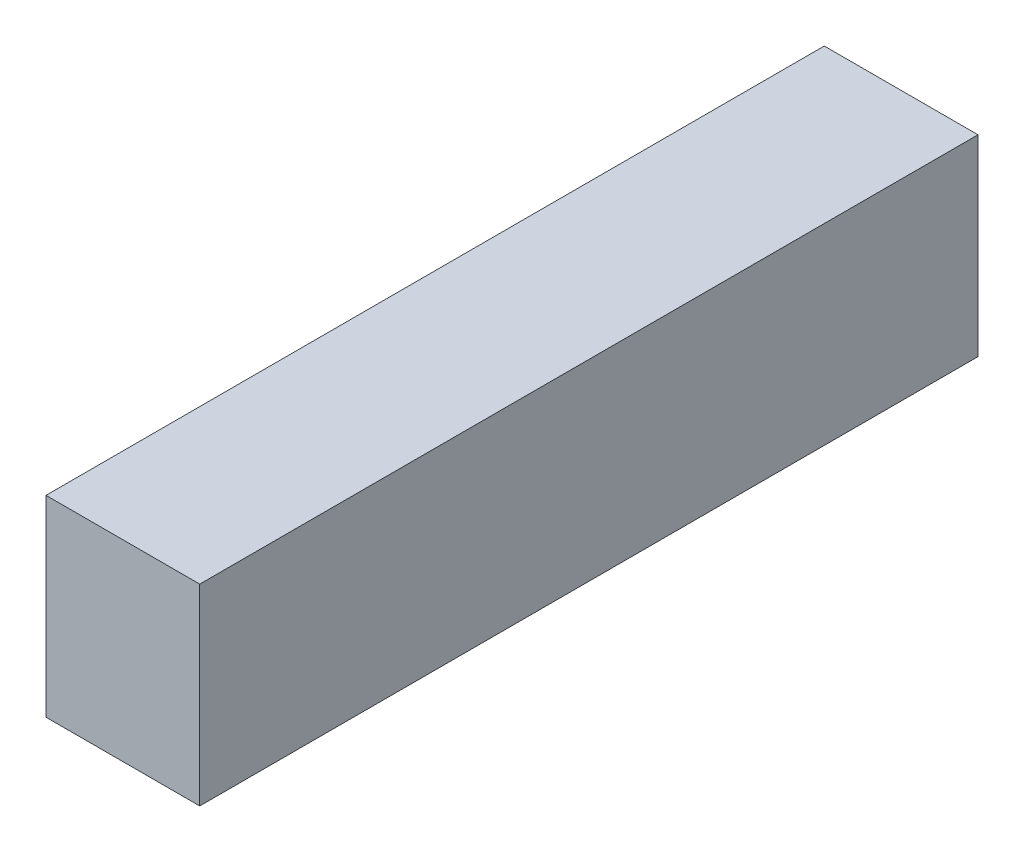
ISO-10303-21;
HEADER;
FILE_DESCRIPTION(('STEP AP214'),'2;1');
FILE_NAME('part.step','',(''),(''),'','','');
FILE_SCHEMA(('AUTOMOTIVE_DESIGN { 1 0 10303 214 1 1 1 1 }'));
ENDSEC;
DATA;
#1=APPLICATION_CONTEXT('core data for automotive mechanical design processes');
#2=APPLICATION_PROTOCOL_DEFINITION('international standard','automotive_design',2000,#1);
#3=PRODUCT_CONTEXT('',#1,'mechanical');
#4=PRODUCT('Part','Part','',(#3));
#5=PRODUCT_RELATED_PRODUCT_CATEGORY('part','',(#4));
#6=PRODUCT_DEFINITION_FORMATION('','',#4);
#7=PRODUCT_DEFINITION_CONTEXT('part definition',#1,'design');
#8=PRODUCT_DEFINITION('design','',#6,#7);
#9=PRODUCT_DEFINITION_SHAPE('','',#8);
#10=(LENGTH_UNIT() NAMED_UNIT(*) SI_UNIT(.MILLI.,.METRE.));
#11=(NAMED_UNIT(*) PLANE_ANGLE_UNIT() SI_UNIT($,.RADIAN.));
#12=(NAMED_UNIT(*) SI_UNIT($,.STERADIAN.) SOLID_ANGLE_UNIT());
#13=UNCERTAINTY_MEASURE_WITH_UNIT(LENGTH_MEASURE(1.E-05),#10,'distance_accuracy_value','');
#14=(GEOMETRIC_REPRESENTATION_CONTEXT(3) GLOBAL_UNCERTAINTY_ASSIGNED_CONTEXT((#13)) GLOBAL_UNIT_ASSIGNED_CONTEXT((#10,
#11,#12)) REPRESENTATION_CONTEXT('',''));
#15=CARTESIAN_POINT('',(0.,0.,0.));
#16=DIRECTION('',(0.,0.,1.));
#17=DIRECTION('',(1.,0.,0.));
#18=AXIS2_PLACEMENT_3D('',#15,#16,#17);
#19=CARTESIAN_POINT('',(-191.340206185567,195.463917525773,1620.));
#20=DIRECTION('',(1.,0.,0.));
#21=DIRECTION('',(0.,1.,0.));
#22=AXIS2_PLACEMENT_3D('',#19,#20,#21);
#23=PLANE('',#22);
#24=DIRECTION('',(0.,-1.,0.));
#25=VECTOR('',#24,1.);
#26=CARTESIAN_POINT('',(-191.340206185567,195.463917525773,0.));
#27=LINE('',#26,#25);
#28=CARTESIAN_POINT('',(-191.340206185567,195.463917525773,0.));
#29=VERTEX_POINT('',#28);
#30=CARTESIAN_POINT('',(-191.340206185567,-204.536082474227,0.));
#31=VERTEX_POINT('',#30);
#32=EDGE_CURVE('E106',#29,#31,#27,.T.);
#33=ORIENTED_EDGE('',*,*,#32,.T.);
#34=DIRECTION('',(0.,0.,-1.));
#35=VECTOR('',#34,1.);
#36=CARTESIAN_POINT('',(-191.340206185567,-204.536082474227,1620.));
#37=LINE('',#36,#35);
#38=CARTESIAN_POINT('',(-191.340206185567,-204.536082474227,1620.));
#39=VERTEX_POINT('',#38);
#40=EDGE_CURVE('E11',#39,#31,#37,.T.);
#41=ORIENTED_EDGE('',*,*,#40,.F.);
#42=DIRECTION('',(0.,-1.,0.));
#43=VECTOR('',#42,1.);
#44=CARTESIAN_POINT('',(-191.340206185567,195.463917525773,1620.));
#45=LINE('',#44,#43);
#46=CARTESIAN_POINT('',(-191.340206185567,195.463917525773,1620.));
#47=VERTEX_POINT('',#46);
#48=EDGE_CURVE('E94',#47,#39,#45,.T.);
#49=ORIENTED_EDGE('',*,*,#48,.F.);
#50=DIRECTION('',(0.,0.,-1.));
#51=VECTOR('',#50,1.);
#52=CARTESIAN_POINT('',(-191.340206185567,195.463917525773,1620.));
#53=LINE('',#52,#51);
#54=EDGE_CURVE('E102',#47,#29,#53,.T.);
#55=ORIENTED_EDGE('',*,*,#54,.T.);
#56=EDGE_LOOP('',(#33,#41,#49,#55));
#57=FACE_BOUND('',#56,.T.);
#58=ADVANCED_FACE('F43',(#57),#23,.F.);
#59=CARTESIAN_POINT('',(-191.340206185567,-204.536082474227,1620.));
#60=DIRECTION('',(0.,1.,0.));
#61=DIRECTION('',(0.,0.,1.));
#62=AXIS2_PLACEMENT_3D('',#59,#60,#61);
#63=PLANE('',#62);
#64=DIRECTION('',(1.,0.,0.));
#65=VECTOR('',#64,1.);
#66=CARTESIAN_POINT('',(-191.340206185567,-204.536082474227,0.));
#67=LINE('',#66,#65);
#68=CARTESIAN_POINT('',(128.659793814433,-204.536082474227,0.));
#69=VERTEX_POINT('',#68);
#70=EDGE_CURVE('E98',#31,#69,#67,.T.);
#71=ORIENTED_EDGE('',*,*,#70,.T.);
#72=DIRECTION('',(0.,0.,-1.));
#73=VECTOR('',#72,1.);
#74=CARTESIAN_POINT('',(128.659793814433,-204.536082474227,1620.));
#75=LINE('',#74,#73);
#76=CARTESIAN_POINT('',(128.659793814433,-204.536082474227,1620.));
#77=VERTEX_POINT('',#76);
#78=EDGE_CURVE('E51',#77,#69,#75,.T.);
#79=ORIENTED_EDGE('',*,*,#78,.F.);
#80=DIRECTION('',(1.,0.,0.));
#81=VECTOR('',#80,1.);
#82=CARTESIAN_POINT('',(-191.340206185567,-204.536082474227,1620.));
#83=LINE('',#82,#81);
#84=EDGE_CURVE('E89',#39,#77,#83,.T.);
#85=ORIENTED_EDGE('',*,*,#84,.F.);
#86=ORIENTED_EDGE('',*,*,#40,.T.);
#87=EDGE_LOOP('',(#71,#79,#85,#86));
#88=FACE_BOUND('',#87,.T.);
#89=ADVANCED_FACE('F97',(#88),#63,.F.);
#90=CARTESIAN_POINT('',(128.659793814433,195.463917525773,1620.));
#91=DIRECTION('',(-1.,0.,0.));
#92=DIRECTION('',(0.,-1.,0.));
#93=AXIS2_PLACEMENT_3D('',#90,#91,#92);
#94=PLANE('',#93);
#95=DIRECTION('',(0.,1.,0.));
#96=VECTOR('',#95,1.);
#97=CARTESIAN_POINT('',(128.659793814433,195.463917525773,0.));
#98=LINE('',#97,#96);
#99=CARTESIAN_POINT('',(128.659793814433,195.463917525773,0.));
#100=VERTEX_POINT('',#99);
#101=EDGE_CURVE('E76',#69,#100,#98,.T.);
#102=ORIENTED_EDGE('',*,*,#101,.T.);
#103=DIRECTION('',(0.,0.,-1.));
#104=VECTOR('',#103,1.);
#105=CARTESIAN_POINT('',(128.659793814433,195.463917525773,1620.));
#106=LINE('',#105,#104);
#107=CARTESIAN_POINT('',(128.659793814433,195.463917525773,1620.));
#108=VERTEX_POINT('',#107);
#109=EDGE_CURVE('E99',#108,#100,#106,.T.);
#110=ORIENTED_EDGE('',*,*,#109,.F.);
#111=DIRECTION('',(0.,1.,0.));
#112=VECTOR('',#111,1.);
#113=CARTESIAN_POINT('',(128.659793814433,195.463917525773,1620.));
#114=LINE('',#113,#112);
#115=EDGE_CURVE('E92',#77,#108,#114,.T.);
#116=ORIENTED_EDGE('',*,*,#115,.F.);
#117=ORIENTED_EDGE('',*,*,#78,.T.);
#118=EDGE_LOOP('',(#102,#110,#116,#117));
#119=FACE_BOUND('',#118,.T.);
#120=ADVANCED_FACE('F100',(#119),#94,.F.);
#121=CARTESIAN_POINT('',(-191.340206185567,195.463917525773,1620.));
#122=DIRECTION('',(0.,-1.,0.));
#123=DIRECTION('',(0.,0.,-1.));
#124=AXIS2_PLACEMENT_3D('',#121,#122,#123);
#125=PLANE('',#124);
#126=DIRECTION('',(-1.,0.,0.));
#127=VECTOR('',#126,1.);
#128=CARTESIAN_POINT('',(-191.340206185567,195.463917525773,0.));
#129=LINE('',#128,#127);
#130=EDGE_CURVE('E82',#100,#29,#129,.T.);
#131=ORIENTED_EDGE('',*,*,#130,.T.);
#132=ORIENTED_EDGE('',*,*,#54,.F.);
#133=DIRECTION('',(-1.,0.,0.));
#134=VECTOR('',#133,1.);
#135=CARTESIAN_POINT('',(-191.340206185567,195.463917525773,1620.));
#136=LINE('',#135,#134);
#137=EDGE_CURVE('E59',#108,#47,#136,.T.);
#138=ORIENTED_EDGE('',*,*,#137,.F.);
#139=ORIENTED_EDGE('',*,*,#109,.T.);
#140=EDGE_LOOP('',(#131,#132,#138,#139));
#141=FACE_BOUND('',#140,.T.);
#142=ADVANCED_FACE('F113',(#141),#125,.F.);
#143=CARTESIAN_POINT('',(0.,0.,1620.));
#144=DIRECTION('',(0.,0.,1.));
#145=DIRECTION('',(1.,0.,0.));
#146=AXIS2_PLACEMENT_3D('',#143,#144,#145);
#147=PLANE('',#146);
#148=ORIENTED_EDGE('',*,*,#48,.T.);
#149=ORIENTED_EDGE('',*,*,#84,.T.);
#150=ORIENTED_EDGE('',*,*,#115,.T.);
#151=ORIENTED_EDGE('',*,*,#137,.T.);
#152=EDGE_LOOP('',(#148,#149,#150,#151));
#153=FACE_BOUND('',#152,.T.);
#154=ADVANCED_FACE('F90',(#153),#147,.T.);
#155=CARTESIAN_POINT('',(0.,0.,0.));
#156=DIRECTION('',(0.,0.,1.));
#157=DIRECTION('',(1.,0.,0.));
#158=AXIS2_PLACEMENT_3D('',#155,#156,#157);
#159=PLANE('',#158);
#160=ORIENTED_EDGE('',*,*,#32,.F.);
#161=ORIENTED_EDGE('',*,*,#130,.F.);
#162=ORIENTED_EDGE('',*,*,#101,.F.);
#163=ORIENTED_EDGE('',*,*,#70,.F.);
#164=EDGE_LOOP('',(#160,#161,#162,#163));
#165=FACE_BOUND('',#164,.T.);
#166=ADVANCED_FACE('F116',(#165),#159,.F.);
#167=CLOSED_SHELL('',(#58,#89,#120,#142,#154,#166));
#168=MANIFOLD_SOLID_BREP('B2',#167);
#169=ADVANCED_BREP_SHAPE_REPRESENTATION('',(#18,#168),#14);
#170=SHAPE_DEFINITION_REPRESENTATION(#9,#169);
ENDSEC;
END-ISO-10303-21;
